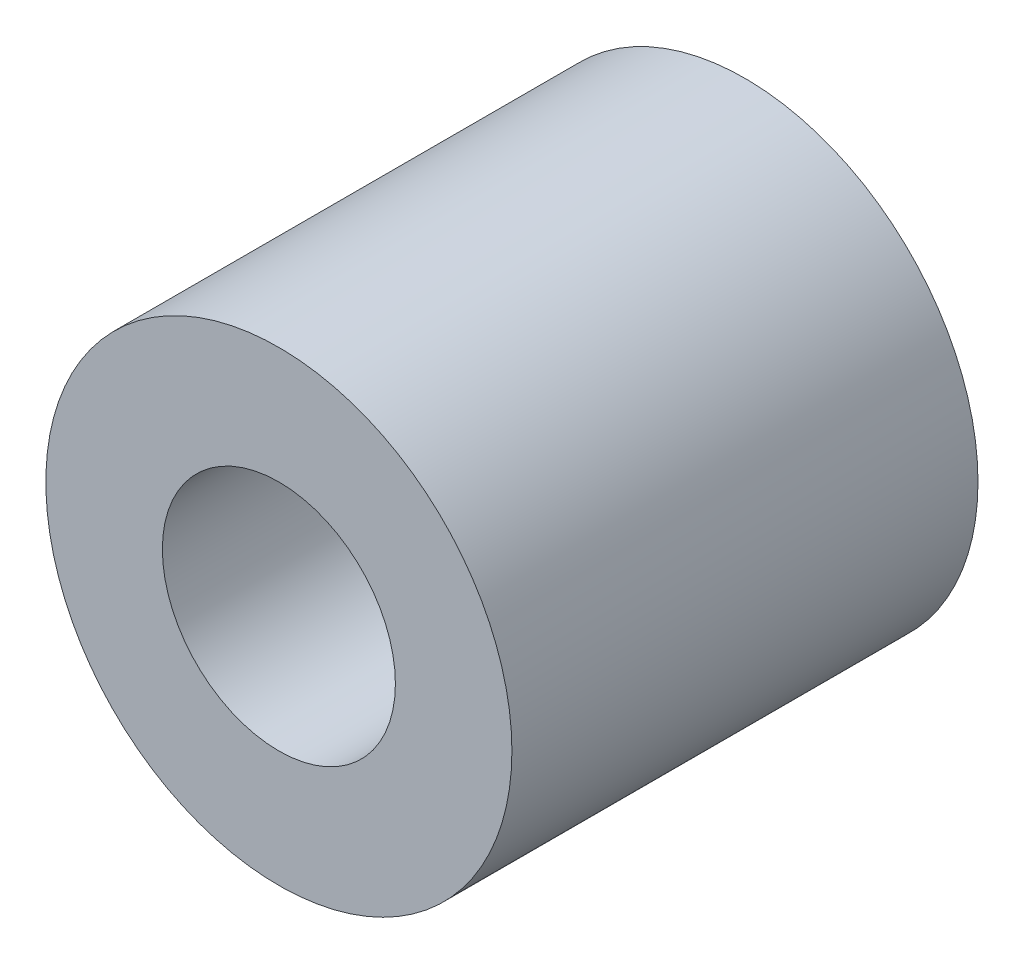
ISO-10303-21;
HEADER;
FILE_DESCRIPTION(('STEP AP214'),'2;1');
FILE_NAME('part.step','',(''),(''),'','','');
FILE_SCHEMA(('AUTOMOTIVE_DESIGN { 1 0 10303 214 1 1 1 1 }'));
ENDSEC;
DATA;
#1=APPLICATION_CONTEXT('core data for automotive mechanical design processes');
#2=APPLICATION_PROTOCOL_DEFINITION('international standard','automotive_design',2000,#1);
#3=PRODUCT_CONTEXT('',#1,'mechanical');
#4=PRODUCT('Part','Part','',(#3));
#5=PRODUCT_RELATED_PRODUCT_CATEGORY('part','',(#4));
#6=PRODUCT_DEFINITION_FORMATION('','',#4);
#7=PRODUCT_DEFINITION_CONTEXT('part definition',#1,'design');
#8=PRODUCT_DEFINITION('design','',#6,#7);
#9=PRODUCT_DEFINITION_SHAPE('','',#8);
#10=(LENGTH_UNIT() NAMED_UNIT(*) SI_UNIT(.MILLI.,.METRE.));
#11=(NAMED_UNIT(*) PLANE_ANGLE_UNIT() SI_UNIT($,.RADIAN.));
#12=(NAMED_UNIT(*) SI_UNIT($,.STERADIAN.) SOLID_ANGLE_UNIT());
#13=UNCERTAINTY_MEASURE_WITH_UNIT(LENGTH_MEASURE(1.E-05),#10,'distance_accuracy_value','');
#14=(GEOMETRIC_REPRESENTATION_CONTEXT(3) GLOBAL_UNCERTAINTY_ASSIGNED_CONTEXT((#13)) GLOBAL_UNIT_ASSIGNED_CONTEXT((#10,
#11,#12)) REPRESENTATION_CONTEXT('',''));
#15=CARTESIAN_POINT('',(0.,0.,0.));
#16=DIRECTION('',(0.,0.,1.));
#17=DIRECTION('',(1.,0.,0.));
#18=AXIS2_PLACEMENT_3D('',#15,#16,#17);
#19=CARTESIAN_POINT('',(0.,0.,4.));
#20=DIRECTION('',(0.,0.,1.));
#21=DIRECTION('',(1.,0.,0.));
#22=AXIS2_PLACEMENT_3D('',#19,#20,#21);
#23=PLANE('',#22);
#24=CARTESIAN_POINT('',(0.,0.,4.));
#25=DIRECTION('',(0.,0.,1.));
#26=DIRECTION('',(1.,0.,0.));
#27=AXIS2_PLACEMENT_3D('',#24,#25,#26);
#28=CIRCLE('',#27,2.);
#29=CARTESIAN_POINT('',(2.,0.,4.));
#30=VERTEX_POINT('',#29);
#31=EDGE_CURVE('E10',#30,#30,#28,.T.);
#32=ORIENTED_EDGE('',*,*,#31,.T.);
#33=EDGE_LOOP('',(#32));
#34=FACE_BOUND('',#33,.T.);
#35=CARTESIAN_POINT('',(0.,0.,4.));
#36=DIRECTION('',(0.,0.,1.));
#37=DIRECTION('',(1.,0.,0.));
#38=AXIS2_PLACEMENT_3D('',#35,#36,#37);
#39=CIRCLE('',#38,1.);
#40=CARTESIAN_POINT('',(1.,0.,4.));
#41=VERTEX_POINT('',#40);
#42=EDGE_CURVE('E44',#41,#41,#39,.T.);
#43=ORIENTED_EDGE('',*,*,#42,.F.);
#44=EDGE_LOOP('',(#43));
#45=FACE_BOUND('',#44,.T.);
#46=ADVANCED_FACE('F33',(#34,#45),#23,.T.);
#47=CARTESIAN_POINT('',(0.,0.,0.));
#48=DIRECTION('',(0.,0.,1.));
#49=DIRECTION('',(1.,0.,0.));
#50=AXIS2_PLACEMENT_3D('',#47,#48,#49);
#51=PLANE('',#50);
#52=CARTESIAN_POINT('',(0.,0.,0.));
#53=DIRECTION('',(0.,0.,1.));
#54=DIRECTION('',(1.,0.,0.));
#55=AXIS2_PLACEMENT_3D('',#52,#53,#54);
#56=CIRCLE('',#55,2.);
#57=CARTESIAN_POINT('',(2.,0.,0.));
#58=VERTEX_POINT('',#57);
#59=EDGE_CURVE('E37',#58,#58,#56,.T.);
#60=ORIENTED_EDGE('',*,*,#59,.F.);
#61=EDGE_LOOP('',(#60));
#62=FACE_BOUND('',#61,.T.);
#63=CARTESIAN_POINT('',(0.,0.,0.));
#64=DIRECTION('',(0.,0.,1.));
#65=DIRECTION('',(1.,0.,0.));
#66=AXIS2_PLACEMENT_3D('',#63,#64,#65);
#67=CIRCLE('',#66,1.);
#68=CARTESIAN_POINT('',(1.,0.,0.));
#69=VERTEX_POINT('',#68);
#70=EDGE_CURVE('E46',#69,#69,#67,.T.);
#71=ORIENTED_EDGE('',*,*,#70,.T.);
#72=EDGE_LOOP('',(#71));
#73=FACE_BOUND('',#72,.T.);
#74=ADVANCED_FACE('F56',(#62,#73),#51,.F.);
#75=CARTESIAN_POINT('',(0.,0.,4.));
#76=DIRECTION('',(0.,0.,-1.));
#77=DIRECTION('',(-1.,0.,0.));
#78=AXIS2_PLACEMENT_3D('',#75,#76,#77);
#79=CYLINDRICAL_SURFACE('',#78,2.);
#80=ORIENTED_EDGE('',*,*,#31,.F.);
#81=EDGE_LOOP('',(#80));
#82=FACE_BOUND('',#81,.T.);
#83=ORIENTED_EDGE('',*,*,#59,.T.);
#84=EDGE_LOOP('',(#83));
#85=FACE_BOUND('',#84,.T.);
#86=ADVANCED_FACE('F35',(#82,#85),#79,.T.);
#87=CARTESIAN_POINT('',(0.,0.,4.));
#88=DIRECTION('',(0.,0.,-1.));
#89=DIRECTION('',(-1.,0.,0.));
#90=AXIS2_PLACEMENT_3D('',#87,#88,#89);
#91=CYLINDRICAL_SURFACE('',#90,1.);
#92=ORIENTED_EDGE('',*,*,#42,.T.);
#93=EDGE_LOOP('',(#92));
#94=FACE_BOUND('',#93,.T.);
#95=ORIENTED_EDGE('',*,*,#70,.F.);
#96=EDGE_LOOP('',(#95));
#97=FACE_BOUND('',#96,.T.);
#98=ADVANCED_FACE('F52',(#94,#97),#91,.F.);
#99=CLOSED_SHELL('',(#46,#74,#86,#98));
#100=MANIFOLD_SOLID_BREP('B2',#99);
#101=ADVANCED_BREP_SHAPE_REPRESENTATION('',(#18,#100),#14);
#102=SHAPE_DEFINITION_REPRESENTATION(#9,#101);
ENDSEC;
END-ISO-10303-21;
